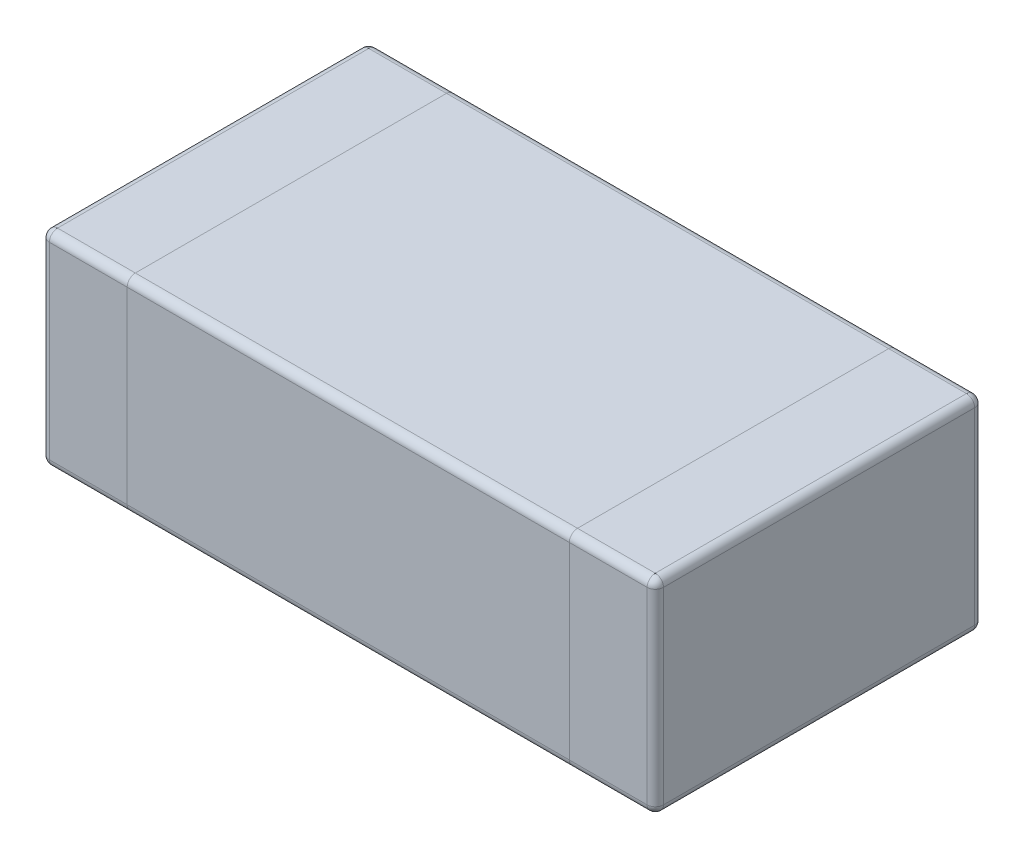
ISO-10303-21;
HEADER;
FILE_DESCRIPTION(('STEP AP214'),'2;1');
FILE_NAME('part.step','',(''),(''),'','','');
FILE_SCHEMA(('AUTOMOTIVE_DESIGN { 1 0 10303 214 1 1 1 1 }'));
ENDSEC;
DATA;
#1=APPLICATION_CONTEXT('core data for automotive mechanical design processes');
#2=APPLICATION_PROTOCOL_DEFINITION('international standard','automotive_design',2000,#1);
#3=PRODUCT_CONTEXT('',#1,'mechanical');
#4=PRODUCT('Part','Part','',(#3));
#5=PRODUCT_RELATED_PRODUCT_CATEGORY('part','',(#4));
#6=PRODUCT_DEFINITION_FORMATION('','',#4);
#7=PRODUCT_DEFINITION_CONTEXT('part definition',#1,'design');
#8=PRODUCT_DEFINITION('design','',#6,#7);
#9=PRODUCT_DEFINITION_SHAPE('','',#8);
#10=(LENGTH_UNIT() NAMED_UNIT(*) SI_UNIT(.MILLI.,.METRE.));
#11=(NAMED_UNIT(*) PLANE_ANGLE_UNIT() SI_UNIT($,.RADIAN.));
#12=(NAMED_UNIT(*) SI_UNIT($,.STERADIAN.) SOLID_ANGLE_UNIT());
#13=UNCERTAINTY_MEASURE_WITH_UNIT(LENGTH_MEASURE(1.E-05),#10,'distance_accuracy_value','');
#14=(GEOMETRIC_REPRESENTATION_CONTEXT(3) GLOBAL_UNCERTAINTY_ASSIGNED_CONTEXT((#13)) GLOBAL_UNIT_ASSIGNED_CONTEXT((#10,
#11,#12)) REPRESENTATION_CONTEXT('',''));
#15=CARTESIAN_POINT('',(0.,0.,0.));
#16=DIRECTION('',(0.,0.,1.));
#17=DIRECTION('',(1.,0.,0.));
#18=AXIS2_PLACEMENT_3D('',#15,#16,#17);
#19=CARTESIAN_POINT('',(-0.73,-0.25,0.38));
#20=DIRECTION('',(0.,1.,0.));
#21=DIRECTION('',(0.,0.,1.));
#22=AXIS2_PLACEMENT_3D('',#19,#20,#21);
#23=PLANE('',#22);
#24=DIRECTION('',(0.,0.,-1.));
#25=VECTOR('',#24,1.);
#26=CARTESIAN_POINT('',(-0.54,-0.25,0.38));
#27=LINE('',#26,#25);
#28=CARTESIAN_POINT('',(-0.54,-0.25,0.38));
#29=VERTEX_POINT('',#28);
#30=CARTESIAN_POINT('',(-0.54,-0.25,-0.38));
#31=VERTEX_POINT('',#30);
#32=EDGE_CURVE('E208',#29,#31,#27,.T.);
#33=ORIENTED_EDGE('',*,*,#32,.F.);
#34=DIRECTION('',(1.,0.,0.));
#35=VECTOR('',#34,1.);
#36=CARTESIAN_POINT('',(-0.73,-0.25,0.38));
#37=LINE('',#36,#35);
#38=CARTESIAN_POINT('',(-0.73,-0.25,0.38));
#39=VERTEX_POINT('',#38);
#40=EDGE_CURVE('E231',#29,#39,#37,.F.);
#41=ORIENTED_EDGE('',*,*,#40,.T.);
#42=DIRECTION('',(0.,0.,1.));
#43=VECTOR('',#42,1.);
#44=CARTESIAN_POINT('',(-0.73,-0.25,0.38));
#45=LINE('',#44,#43);
#46=CARTESIAN_POINT('',(-0.73,-0.25,-0.38));
#47=VERTEX_POINT('',#46);
#48=EDGE_CURVE('E229',#39,#47,#45,.F.);
#49=ORIENTED_EDGE('',*,*,#48,.T.);
#50=DIRECTION('',(-1.,0.,0.));
#51=VECTOR('',#50,1.);
#52=CARTESIAN_POINT('',(-0.73,-0.25,-0.38));
#53=LINE('',#52,#51);
#54=EDGE_CURVE('E227',#47,#31,#53,.F.);
#55=ORIENTED_EDGE('',*,*,#54,.T.);
#56=EDGE_LOOP('',(#33,#41,#49,#55));
#57=FACE_BOUND('',#56,.T.);
#58=ADVANCED_FACE('F37',(#57),#23,.F.);
#59=DIRECTION('',(0.,0.,-1.));
#60=VECTOR('',#59,1.);
#61=CARTESIAN_POINT('',(0.54,-0.25,0.38));
#62=LINE('',#61,#60);
#63=CARTESIAN_POINT('',(0.54,-0.25,0.38));
#64=VERTEX_POINT('',#63);
#65=CARTESIAN_POINT('',(0.54,-0.25,-0.38));
#66=VERTEX_POINT('',#65);
#67=EDGE_CURVE('E214',#64,#66,#62,.T.);
#68=ORIENTED_EDGE('',*,*,#67,.F.);
#69=DIRECTION('',(1.,0.,0.));
#70=VECTOR('',#69,1.);
#71=CARTESIAN_POINT('',(-0.73,-0.25,0.38));
#72=LINE('',#71,#70);
#73=EDGE_CURVE('E219',#64,#29,#72,.F.);
#74=ORIENTED_EDGE('',*,*,#73,.T.);
#75=ORIENTED_EDGE('',*,*,#32,.T.);
#76=DIRECTION('',(-1.,0.,0.));
#77=VECTOR('',#76,1.);
#78=CARTESIAN_POINT('',(-0.73,-0.25,-0.38));
#79=LINE('',#78,#77);
#80=EDGE_CURVE('E210',#31,#66,#79,.F.);
#81=ORIENTED_EDGE('',*,*,#80,.T.);
#82=EDGE_LOOP('',(#68,#74,#75,#81));
#83=FACE_BOUND('',#82,.T.);
#84=ADVANCED_FACE('F445',(#83),#23,.F.);
#85=CARTESIAN_POINT('',(-0.73,0.25,-0.4));
#86=DIRECTION('',(0.,0.,1.));
#87=DIRECTION('',(1.,0.,0.));
#88=AXIS2_PLACEMENT_3D('',#85,#86,#87);
#89=PLANE('',#88);
#90=DIRECTION('',(0.,-1.,0.));
#91=VECTOR('',#90,1.);
#92=CARTESIAN_POINT('',(0.54,0.25,-0.4));
#93=LINE('',#92,#91);
#94=CARTESIAN_POINT('',(0.54,0.23,-0.4));
#95=VERTEX_POINT('',#94);
#96=CARTESIAN_POINT('',(0.54,-0.23,-0.4));
#97=VERTEX_POINT('',#96);
#98=EDGE_CURVE('E194',#95,#97,#93,.T.);
#99=ORIENTED_EDGE('',*,*,#98,.T.);
#100=DIRECTION('',(-1.,0.,0.));
#101=VECTOR('',#100,1.);
#102=CARTESIAN_POINT('',(-0.73,-0.23,-0.4));
#103=LINE('',#102,#101);
#104=CARTESIAN_POINT('',(-0.54,-0.23,-0.4));
#105=VERTEX_POINT('',#104);
#106=EDGE_CURVE('E251',#97,#105,#103,.T.);
#107=ORIENTED_EDGE('',*,*,#106,.T.);
#108=DIRECTION('',(0.,-1.,0.));
#109=VECTOR('',#108,1.);
#110=CARTESIAN_POINT('',(-0.54,0.25,-0.4));
#111=LINE('',#110,#109);
#112=CARTESIAN_POINT('',(-0.54,0.23,-0.4));
#113=VERTEX_POINT('',#112);
#114=EDGE_CURVE('E401',#113,#105,#111,.T.);
#115=ORIENTED_EDGE('',*,*,#114,.F.);
#116=DIRECTION('',(-1.,0.,0.));
#117=VECTOR('',#116,1.);
#118=CARTESIAN_POINT('',(0.54,0.23,-0.4));
#119=LINE('',#118,#117);
#120=EDGE_CURVE('E249',#113,#95,#119,.F.);
#121=ORIENTED_EDGE('',*,*,#120,.T.);
#122=EDGE_LOOP('',(#99,#107,#115,#121));
#123=FACE_BOUND('',#122,.T.);
#124=ADVANCED_FACE('F506',(#123),#89,.F.);
#125=DIRECTION('',(0.,-1.,0.));
#126=VECTOR('',#125,1.);
#127=CARTESIAN_POINT('',(0.73,0.25,-0.4));
#128=LINE('',#127,#126);
#129=CARTESIAN_POINT('',(0.73,0.23,-0.4));
#130=VERTEX_POINT('',#129);
#131=CARTESIAN_POINT('',(0.73,-0.23,-0.4));
#132=VERTEX_POINT('',#131);
#133=EDGE_CURVE('E366',#130,#132,#128,.T.);
#134=ORIENTED_EDGE('',*,*,#133,.T.);
#135=DIRECTION('',(-1.,0.,0.));
#136=VECTOR('',#135,1.);
#137=CARTESIAN_POINT('',(-0.73,-0.23,-0.4));
#138=LINE('',#137,#136);
#139=EDGE_CURVE('E255',#132,#97,#138,.T.);
#140=ORIENTED_EDGE('',*,*,#139,.T.);
#141=ORIENTED_EDGE('',*,*,#98,.F.);
#142=DIRECTION('',(-1.,0.,0.));
#143=VECTOR('',#142,1.);
#144=CARTESIAN_POINT('',(0.73,0.23,-0.4));
#145=LINE('',#144,#143);
#146=EDGE_CURVE('E253',#95,#130,#145,.F.);
#147=ORIENTED_EDGE('',*,*,#146,.T.);
#148=EDGE_LOOP('',(#134,#140,#141,#147));
#149=FACE_BOUND('',#148,.T.);
#150=ADVANCED_FACE('F365',(#149),#89,.F.);
#151=CARTESIAN_POINT('',(-0.73,0.25,0.4));
#152=DIRECTION('',(0.,0.,-1.));
#153=DIRECTION('',(-1.,0.,0.));
#154=AXIS2_PLACEMENT_3D('',#151,#152,#153);
#155=PLANE('',#154);
#156=DIRECTION('',(0.,-1.,0.));
#157=VECTOR('',#156,1.);
#158=CARTESIAN_POINT('',(-0.54,0.25,0.4));
#159=LINE('',#158,#157);
#160=CARTESIAN_POINT('',(-0.54,0.23,0.4));
#161=VERTEX_POINT('',#160);
#162=CARTESIAN_POINT('',(-0.54,-0.23,0.4));
#163=VERTEX_POINT('',#162);
#164=EDGE_CURVE('E195',#161,#163,#159,.T.);
#165=ORIENTED_EDGE('',*,*,#164,.T.);
#166=DIRECTION('',(1.,0.,0.));
#167=VECTOR('',#166,1.);
#168=CARTESIAN_POINT('',(-0.73,-0.23,0.4));
#169=LINE('',#168,#167);
#170=CARTESIAN_POINT('',(0.54,-0.23,0.4));
#171=VERTEX_POINT('',#170);
#172=EDGE_CURVE('E192',#163,#171,#169,.T.);
#173=ORIENTED_EDGE('',*,*,#172,.T.);
#174=DIRECTION('',(0.,-1.,0.));
#175=VECTOR('',#174,1.);
#176=CARTESIAN_POINT('',(0.54,0.25,0.4));
#177=LINE('',#176,#175);
#178=CARTESIAN_POINT('',(0.54,0.23,0.4));
#179=VERTEX_POINT('',#178);
#180=EDGE_CURVE('E177',#179,#171,#177,.T.);
#181=ORIENTED_EDGE('',*,*,#180,.F.);
#182=DIRECTION('',(1.,0.,0.));
#183=VECTOR('',#182,1.);
#184=CARTESIAN_POINT('',(-0.54,0.23,0.4));
#185=LINE('',#184,#183);
#186=EDGE_CURVE('E189',#179,#161,#185,.F.);
#187=ORIENTED_EDGE('',*,*,#186,.T.);
#188=EDGE_LOOP('',(#165,#173,#181,#187));
#189=FACE_BOUND('',#188,.T.);
#190=ADVANCED_FACE('F187',(#189),#155,.F.);
#191=DIRECTION('',(0.,-1.,0.));
#192=VECTOR('',#191,1.);
#193=CARTESIAN_POINT('',(-0.73,0.25,0.4));
#194=LINE('',#193,#192);
#195=CARTESIAN_POINT('',(-0.73,0.23,0.4));
#196=VERTEX_POINT('',#195);
#197=CARTESIAN_POINT('',(-0.73,-0.23,0.4));
#198=VERTEX_POINT('',#197);
#199=EDGE_CURVE('E387',#196,#198,#194,.T.);
#200=ORIENTED_EDGE('',*,*,#199,.T.);
#201=DIRECTION('',(1.,0.,0.));
#202=VECTOR('',#201,1.);
#203=CARTESIAN_POINT('',(-0.73,-0.23,0.4));
#204=LINE('',#203,#202);
#205=EDGE_CURVE('E225',#198,#163,#204,.T.);
#206=ORIENTED_EDGE('',*,*,#205,.T.);
#207=ORIENTED_EDGE('',*,*,#164,.F.);
#208=DIRECTION('',(1.,0.,0.));
#209=VECTOR('',#208,1.);
#210=CARTESIAN_POINT('',(-0.73,0.23,0.4));
#211=LINE('',#210,#209);
#212=EDGE_CURVE('E222',#161,#196,#211,.F.);
#213=ORIENTED_EDGE('',*,*,#212,.T.);
#214=EDGE_LOOP('',(#200,#206,#207,#213));
#215=FACE_BOUND('',#214,.T.);
#216=ADVANCED_FACE('F481',(#215),#155,.F.);
#217=CARTESIAN_POINT('',(-0.73,0.25,0.38));
#218=DIRECTION('',(0.,1.,0.));
#219=DIRECTION('',(0.,0.,1.));
#220=AXIS2_PLACEMENT_3D('',#217,#218,#219);
#221=PLANE('',#220);
#222=DIRECTION('',(0.,0.,-1.));
#223=VECTOR('',#222,1.);
#224=CARTESIAN_POINT('',(0.73,0.25,-0.38));
#225=LINE('',#224,#223);
#226=CARTESIAN_POINT('',(0.73,0.25,0.38));
#227=VERTEX_POINT('',#226);
#228=CARTESIAN_POINT('',(0.73,0.25,-0.38));
#229=VERTEX_POINT('',#228);
#230=EDGE_CURVE('E54',#227,#229,#225,.T.);
#231=ORIENTED_EDGE('',*,*,#230,.T.);
#232=DIRECTION('',(-1.,0.,0.));
#233=VECTOR('',#232,1.);
#234=CARTESIAN_POINT('',(0.54,0.25,-0.38));
#235=LINE('',#234,#233);
#236=CARTESIAN_POINT('',(0.54,0.25,-0.38));
#237=VERTEX_POINT('',#236);
#238=EDGE_CURVE('E288',#229,#237,#235,.T.);
#239=ORIENTED_EDGE('',*,*,#238,.T.);
#240=DIRECTION('',(0.,0.,1.));
#241=VECTOR('',#240,1.);
#242=CARTESIAN_POINT('',(0.54,0.25,0.38));
#243=LINE('',#242,#241);
#244=CARTESIAN_POINT('',(0.54,0.25,0.38));
#245=VERTEX_POINT('',#244);
#246=EDGE_CURVE('E394',#237,#245,#243,.T.);
#247=ORIENTED_EDGE('',*,*,#246,.T.);
#248=DIRECTION('',(1.,0.,0.));
#249=VECTOR('',#248,1.);
#250=CARTESIAN_POINT('',(0.73,0.25,0.38));
#251=LINE('',#250,#249);
#252=EDGE_CURVE('E59',#245,#227,#251,.T.);
#253=ORIENTED_EDGE('',*,*,#252,.T.);
#254=EDGE_LOOP('',(#231,#239,#247,#253));
#255=FACE_BOUND('',#254,.T.);
#256=ADVANCED_FACE('F492',(#255),#221,.T.);
#257=ORIENTED_EDGE('',*,*,#246,.F.);
#258=DIRECTION('',(-1.,0.,0.));
#259=VECTOR('',#258,1.);
#260=CARTESIAN_POINT('',(-0.54,0.25,-0.38));
#261=LINE('',#260,#259);
#262=CARTESIAN_POINT('',(-0.54,0.25,-0.38));
#263=VERTEX_POINT('',#262);
#264=EDGE_CURVE('E284',#237,#263,#261,.T.);
#265=ORIENTED_EDGE('',*,*,#264,.T.);
#266=DIRECTION('',(0.,0.,1.));
#267=VECTOR('',#266,1.);
#268=CARTESIAN_POINT('',(-0.54,0.25,0.38));
#269=LINE('',#268,#267);
#270=CARTESIAN_POINT('',(-0.54,0.25,0.38));
#271=VERTEX_POINT('',#270);
#272=EDGE_CURVE('E390',#263,#271,#269,.T.);
#273=ORIENTED_EDGE('',*,*,#272,.T.);
#274=DIRECTION('',(1.,0.,0.));
#275=VECTOR('',#274,1.);
#276=CARTESIAN_POINT('',(0.54,0.25,0.38));
#277=LINE('',#276,#275);
#278=EDGE_CURVE('E282',#271,#245,#277,.T.);
#279=ORIENTED_EDGE('',*,*,#278,.T.);
#280=EDGE_LOOP('',(#257,#265,#273,#279));
#281=FACE_BOUND('',#280,.T.);
#282=ADVANCED_FACE('F491',(#281),#221,.T.);
#283=CARTESIAN_POINT('',(-0.73,0.25,0.38));
#284=DIRECTION('',(0.,-1.,0.));
#285=DIRECTION('',(0.,0.,-1.));
#286=AXIS2_PLACEMENT_3D('',#283,#284,#285);
#287=CYLINDRICAL_SURFACE('',#286,0.02);
#288=DIRECTION('',(0.,-1.,0.));
#289=VECTOR('',#288,1.);
#290=CARTESIAN_POINT('',(-0.75,0.25,0.38));
#291=LINE('',#290,#289);
#292=CARTESIAN_POINT('',(-0.75,0.23,0.38));
#293=VERTEX_POINT('',#292);
#294=CARTESIAN_POINT('',(-0.75,-0.23,0.38));
#295=VERTEX_POINT('',#294);
#296=EDGE_CURVE('E325',#293,#295,#291,.T.);
#297=ORIENTED_EDGE('',*,*,#296,.T.);
#298=CARTESIAN_POINT('',(-0.73,-0.23,0.38));
#299=DIRECTION('',(0.,-1.,0.));
#300=DIRECTION('',(0.,0.,-1.));
#301=AXIS2_PLACEMENT_3D('',#298,#299,#300);
#302=CIRCLE('',#301,0.02);
#303=EDGE_CURVE('E235',#295,#198,#302,.F.);
#304=ORIENTED_EDGE('',*,*,#303,.T.);
#305=ORIENTED_EDGE('',*,*,#199,.F.);
#306=CARTESIAN_POINT('',(-0.73,0.23,0.38));
#307=DIRECTION('',(0.,-1.,0.));
#308=DIRECTION('',(0.,0.,-1.));
#309=AXIS2_PLACEMENT_3D('',#306,#307,#308);
#310=CIRCLE('',#309,0.02);
#311=EDGE_CURVE('E233',#196,#293,#310,.T.);
#312=ORIENTED_EDGE('',*,*,#311,.T.);
#313=EDGE_LOOP('',(#297,#304,#305,#312));
#314=FACE_BOUND('',#313,.T.);
#315=ADVANCED_FACE('F470',(#314),#287,.T.);
#316=DIRECTION('',(0.,-1.,0.));
#317=VECTOR('',#316,1.);
#318=CARTESIAN_POINT('',(0.73,0.25,0.4));
#319=LINE('',#318,#317);
#320=CARTESIAN_POINT('',(0.73,0.23,0.4));
#321=VERTEX_POINT('',#320);
#322=CARTESIAN_POINT('',(0.73,-0.23,0.4));
#323=VERTEX_POINT('',#322);
#324=EDGE_CURVE('E179',#321,#323,#319,.T.);
#325=ORIENTED_EDGE('',*,*,#324,.F.);
#326=DIRECTION('',(1.,0.,0.));
#327=VECTOR('',#326,1.);
#328=CARTESIAN_POINT('',(0.54,0.23,0.4));
#329=LINE('',#328,#327);
#330=EDGE_CURVE('E11',#321,#179,#329,.F.);
#331=ORIENTED_EDGE('',*,*,#330,.T.);
#332=ORIENTED_EDGE('',*,*,#180,.T.);
#333=DIRECTION('',(1.,0.,0.));
#334=VECTOR('',#333,1.);
#335=CARTESIAN_POINT('',(-0.73,-0.23,0.4));
#336=LINE('',#335,#334);
#337=EDGE_CURVE('E46',#171,#323,#336,.T.);
#338=ORIENTED_EDGE('',*,*,#337,.T.);
#339=EDGE_LOOP('',(#325,#331,#332,#338));
#340=FACE_BOUND('',#339,.T.);
#341=ADVANCED_FACE('F176',(#340),#155,.F.);
#342=CARTESIAN_POINT('',(0.73,0.25,0.38));
#343=DIRECTION('',(0.,-1.,0.));
#344=DIRECTION('',(0.,0.,-1.));
#345=AXIS2_PLACEMENT_3D('',#342,#343,#344);
#346=CYLINDRICAL_SURFACE('',#345,0.0200000000000001);
#347=ORIENTED_EDGE('',*,*,#324,.T.);
#348=CARTESIAN_POINT('',(0.73,-0.23,0.38));
#349=DIRECTION('',(0.,-1.,0.));
#350=DIRECTION('',(0.,0.,-1.));
#351=AXIS2_PLACEMENT_3D('',#348,#349,#350);
#352=CIRCLE('',#351,0.0200000000000001);
#353=CARTESIAN_POINT('',(0.75,-0.23,0.38));
#354=VERTEX_POINT('',#353);
#355=EDGE_CURVE('E273',#323,#354,#352,.F.);
#356=ORIENTED_EDGE('',*,*,#355,.T.);
#357=DIRECTION('',(0.,-1.,0.));
#358=VECTOR('',#357,1.);
#359=CARTESIAN_POINT('',(0.75,0.25,0.38));
#360=LINE('',#359,#358);
#361=CARTESIAN_POINT('',(0.75,0.23,0.38));
#362=VERTEX_POINT('',#361);
#363=EDGE_CURVE('E377',#362,#354,#360,.T.);
#364=ORIENTED_EDGE('',*,*,#363,.F.);
#365=CARTESIAN_POINT('',(0.73,0.23,0.38));
#366=DIRECTION('',(0.,-1.,0.));
#367=DIRECTION('',(0.,0.,-1.));
#368=AXIS2_PLACEMENT_3D('',#365,#366,#367);
#369=CIRCLE('',#368,0.0200000000000001);
#370=EDGE_CURVE('E271',#362,#321,#369,.T.);
#371=ORIENTED_EDGE('',*,*,#370,.T.);
#372=EDGE_LOOP('',(#347,#356,#364,#371));
#373=FACE_BOUND('',#372,.T.);
#374=ADVANCED_FACE('F782',(#373),#346,.T.);
#375=CARTESIAN_POINT('',(0.75,0.25,0.38));
#376=DIRECTION('',(-1.,0.,0.));
#377=DIRECTION('',(0.,0.,1.));
#378=AXIS2_PLACEMENT_3D('',#375,#376,#377);
#379=PLANE('',#378);
#380=ORIENTED_EDGE('',*,*,#363,.T.);
#381=DIRECTION('',(0.,0.,-1.));
#382=VECTOR('',#381,1.);
#383=CARTESIAN_POINT('',(0.75,-0.23,0.38));
#384=LINE('',#383,#382);
#385=CARTESIAN_POINT('',(0.75,-0.23,-0.38));
#386=VERTEX_POINT('',#385);
#387=EDGE_CURVE('E269',#354,#386,#384,.T.);
#388=ORIENTED_EDGE('',*,*,#387,.T.);
#389=DIRECTION('',(0.,-1.,0.));
#390=VECTOR('',#389,1.);
#391=CARTESIAN_POINT('',(0.75,0.25,-0.38));
#392=LINE('',#391,#390);
#393=CARTESIAN_POINT('',(0.75,0.23,-0.38));
#394=VERTEX_POINT('',#393);
#395=EDGE_CURVE('E374',#394,#386,#392,.T.);
#396=ORIENTED_EDGE('',*,*,#395,.F.);
#397=DIRECTION('',(0.,0.,-1.));
#398=VECTOR('',#397,1.);
#399=CARTESIAN_POINT('',(0.75,0.23,0.38));
#400=LINE('',#399,#398);
#401=EDGE_CURVE('E267',#394,#362,#400,.F.);
#402=ORIENTED_EDGE('',*,*,#401,.T.);
#403=EDGE_LOOP('',(#380,#388,#396,#402));
#404=FACE_BOUND('',#403,.T.);
#405=ADVANCED_FACE('F790',(#404),#379,.F.);
#406=CARTESIAN_POINT('',(0.73,0.25,-0.38));
#407=DIRECTION('',(0.,-1.,0.));
#408=DIRECTION('',(0.,0.,-1.));
#409=AXIS2_PLACEMENT_3D('',#406,#407,#408);
#410=CYLINDRICAL_SURFACE('',#409,0.0200000000000001);
#411=ORIENTED_EDGE('',*,*,#395,.T.);
#412=CARTESIAN_POINT('',(0.73,-0.23,-0.38));
#413=DIRECTION('',(0.,-1.,0.));
#414=DIRECTION('',(0.,0.,-1.));
#415=AXIS2_PLACEMENT_3D('',#412,#413,#414);
#416=CIRCLE('',#415,0.0200000000000001);
#417=EDGE_CURVE('E265',#386,#132,#416,.F.);
#418=ORIENTED_EDGE('',*,*,#417,.T.);
#419=ORIENTED_EDGE('',*,*,#133,.F.);
#420=CARTESIAN_POINT('',(0.73,0.23,-0.38));
#421=DIRECTION('',(0.,-1.,0.));
#422=DIRECTION('',(0.,0.,-1.));
#423=AXIS2_PLACEMENT_3D('',#420,#421,#422);
#424=CIRCLE('',#423,0.0200000000000001);
#425=EDGE_CURVE('E263',#130,#394,#424,.T.);
#426=ORIENTED_EDGE('',*,*,#425,.T.);
#427=EDGE_LOOP('',(#411,#418,#419,#426));
#428=FACE_BOUND('',#427,.T.);
#429=ADVANCED_FACE('F371',(#428),#410,.T.);
#430=ORIENTED_EDGE('',*,*,#114,.T.);
#431=DIRECTION('',(-1.,0.,0.));
#432=VECTOR('',#431,1.);
#433=CARTESIAN_POINT('',(-0.73,-0.23,-0.4));
#434=LINE('',#433,#432);
#435=CARTESIAN_POINT('',(-0.73,-0.23,-0.4));
#436=VERTEX_POINT('',#435);
#437=EDGE_CURVE('E247',#105,#436,#434,.T.);
#438=ORIENTED_EDGE('',*,*,#437,.T.);
#439=DIRECTION('',(0.,-1.,0.));
#440=VECTOR('',#439,1.);
#441=CARTESIAN_POINT('',(-0.73,0.25,-0.4));
#442=LINE('',#441,#440);
#443=CARTESIAN_POINT('',(-0.73,0.23,-0.4));
#444=VERTEX_POINT('',#443);
#445=EDGE_CURVE('E375',#444,#436,#442,.T.);
#446=ORIENTED_EDGE('',*,*,#445,.F.);
#447=DIRECTION('',(-1.,0.,0.));
#448=VECTOR('',#447,1.);
#449=CARTESIAN_POINT('',(-0.54,0.23,-0.4));
#450=LINE('',#449,#448);
#451=EDGE_CURVE('E245',#444,#113,#450,.F.);
#452=ORIENTED_EDGE('',*,*,#451,.T.);
#453=EDGE_LOOP('',(#430,#438,#446,#452));
#454=FACE_BOUND('',#453,.T.);
#455=ADVANCED_FACE('F733',(#454),#89,.F.);
#456=CARTESIAN_POINT('',(-0.73,0.25,-0.38));
#457=DIRECTION('',(0.,-1.,0.));
#458=DIRECTION('',(0.,0.,-1.));
#459=AXIS2_PLACEMENT_3D('',#456,#457,#458);
#460=CYLINDRICAL_SURFACE('',#459,0.02);
#461=ORIENTED_EDGE('',*,*,#445,.T.);
#462=CARTESIAN_POINT('',(-0.73,-0.23,-0.38));
#463=DIRECTION('',(0.,-1.,0.));
#464=DIRECTION('',(0.,0.,-1.));
#465=AXIS2_PLACEMENT_3D('',#462,#463,#464);
#466=CIRCLE('',#465,0.02);
#467=CARTESIAN_POINT('',(-0.75,-0.23,-0.38));
#468=VERTEX_POINT('',#467);
#469=EDGE_CURVE('E243',#436,#468,#466,.F.);
#470=ORIENTED_EDGE('',*,*,#469,.T.);
#471=DIRECTION('',(0.,-1.,0.));
#472=VECTOR('',#471,1.);
#473=CARTESIAN_POINT('',(-0.75,0.25,-0.38));
#474=LINE('',#473,#472);
#475=CARTESIAN_POINT('',(-0.75,0.23,-0.38));
#476=VERTEX_POINT('',#475);
#477=EDGE_CURVE('E380',#476,#468,#474,.T.);
#478=ORIENTED_EDGE('',*,*,#477,.F.);
#479=CARTESIAN_POINT('',(-0.73,0.23,-0.38));
#480=DIRECTION('',(0.,-1.,0.));
#481=DIRECTION('',(0.,0.,-1.));
#482=AXIS2_PLACEMENT_3D('',#479,#480,#481);
#483=CIRCLE('',#482,0.02);
#484=EDGE_CURVE('E241',#476,#444,#483,.T.);
#485=ORIENTED_EDGE('',*,*,#484,.T.);
#486=EDGE_LOOP('',(#461,#470,#478,#485));
#487=FACE_BOUND('',#486,.T.);
#488=ADVANCED_FACE('F817',(#487),#460,.T.);
#489=CARTESIAN_POINT('',(-0.75,0.25,0.38));
#490=DIRECTION('',(1.,0.,0.));
#491=DIRECTION('',(0.,0.,-1.));
#492=AXIS2_PLACEMENT_3D('',#489,#490,#491);
#493=PLANE('',#492);
#494=ORIENTED_EDGE('',*,*,#477,.T.);
#495=DIRECTION('',(0.,0.,1.));
#496=VECTOR('',#495,1.);
#497=CARTESIAN_POINT('',(-0.75,-0.23,0.38));
#498=LINE('',#497,#496);
#499=EDGE_CURVE('E239',#468,#295,#498,.T.);
#500=ORIENTED_EDGE('',*,*,#499,.T.);
#501=ORIENTED_EDGE('',*,*,#296,.F.);
#502=DIRECTION('',(0.,0.,1.));
#503=VECTOR('',#502,1.);
#504=CARTESIAN_POINT('',(-0.75,0.23,-0.38));
#505=LINE('',#504,#503);
#506=EDGE_CURVE('E237',#293,#476,#505,.F.);
#507=ORIENTED_EDGE('',*,*,#506,.T.);
#508=EDGE_LOOP('',(#494,#500,#501,#507));
#509=FACE_BOUND('',#508,.T.);
#510=ADVANCED_FACE('F466',(#509),#493,.F.);
#511=DIRECTION('',(0.,0.,1.));
#512=VECTOR('',#511,1.);
#513=CARTESIAN_POINT('',(-0.73,0.25,0.38));
#514=LINE('',#513,#512);
#515=CARTESIAN_POINT('',(-0.73,0.25,-0.38));
#516=VERTEX_POINT('',#515);
#517=CARTESIAN_POINT('',(-0.73,0.25,0.38));
#518=VERTEX_POINT('',#517);
#519=EDGE_CURVE('E277',#516,#518,#514,.T.);
#520=ORIENTED_EDGE('',*,*,#519,.T.);
#521=DIRECTION('',(1.,0.,0.));
#522=VECTOR('',#521,1.);
#523=CARTESIAN_POINT('',(-0.54,0.25,0.38));
#524=LINE('',#523,#522);
#525=EDGE_CURVE('E279',#518,#271,#524,.T.);
#526=ORIENTED_EDGE('',*,*,#525,.T.);
#527=ORIENTED_EDGE('',*,*,#272,.F.);
#528=DIRECTION('',(-1.,0.,0.));
#529=VECTOR('',#528,1.);
#530=CARTESIAN_POINT('',(-0.73,0.25,-0.38));
#531=LINE('',#530,#529);
#532=EDGE_CURVE('E275',#263,#516,#531,.T.);
#533=ORIENTED_EDGE('',*,*,#532,.T.);
#534=EDGE_LOOP('',(#520,#526,#527,#533));
#535=FACE_BOUND('',#534,.T.);
#536=ADVANCED_FACE('F487',(#535),#221,.T.);
#537=ORIENTED_EDGE('',*,*,#67,.T.);
#538=DIRECTION('',(-1.,0.,0.));
#539=VECTOR('',#538,1.);
#540=CARTESIAN_POINT('',(-0.73,-0.25,-0.38));
#541=LINE('',#540,#539);
#542=CARTESIAN_POINT('',(0.73,-0.25,-0.38));
#543=VERTEX_POINT('',#542);
#544=EDGE_CURVE('E261',#66,#543,#541,.F.);
#545=ORIENTED_EDGE('',*,*,#544,.T.);
#546=DIRECTION('',(0.,0.,-1.));
#547=VECTOR('',#546,1.);
#548=CARTESIAN_POINT('',(0.73,-0.25,0.38));
#549=LINE('',#548,#547);
#550=CARTESIAN_POINT('',(0.73,-0.25,0.38));
#551=VERTEX_POINT('',#550);
#552=EDGE_CURVE('E259',#543,#551,#549,.F.);
#553=ORIENTED_EDGE('',*,*,#552,.T.);
#554=DIRECTION('',(1.,0.,0.));
#555=VECTOR('',#554,1.);
#556=CARTESIAN_POINT('',(-0.73,-0.25,0.38));
#557=LINE('',#556,#555);
#558=EDGE_CURVE('E257',#551,#64,#557,.F.);
#559=ORIENTED_EDGE('',*,*,#558,.T.);
#560=EDGE_LOOP('',(#537,#545,#553,#559));
#561=FACE_BOUND('',#560,.T.);
#562=ADVANCED_FACE('F411',(#561),#23,.F.);
#563=CARTESIAN_POINT('',(-0.73,-0.23,-0.38));
#564=DIRECTION('',(-1.,0.,0.));
#565=DIRECTION('',(0.,0.,1.));
#566=AXIS2_PLACEMENT_3D('',#563,#564,#565);
#567=CYLINDRICAL_SURFACE('',#566,0.02);
#568=CARTESIAN_POINT('',(0.54,-0.23,-0.38));
#569=DIRECTION('',(1.,0.,0.));
#570=DIRECTION('',(0.,0.,-1.));
#571=AXIS2_PLACEMENT_3D('',#568,#569,#570);
#572=CIRCLE('',#571,0.02);
#573=EDGE_CURVE('E319',#66,#97,#572,.T.);
#574=ORIENTED_EDGE('',*,*,#573,.F.);
#575=ORIENTED_EDGE('',*,*,#80,.F.);
#576=CARTESIAN_POINT('',(-0.54,-0.23,-0.38));
#577=DIRECTION('',(-1.,0.,0.));
#578=DIRECTION('',(0.,-1.,0.));
#579=AXIS2_PLACEMENT_3D('',#576,#577,#578);
#580=CIRCLE('',#579,0.02);
#581=EDGE_CURVE('E322',#105,#31,#580,.T.);
#582=ORIENTED_EDGE('',*,*,#581,.F.);
#583=ORIENTED_EDGE('',*,*,#106,.F.);
#584=EDGE_LOOP('',(#574,#575,#582,#583));
#585=FACE_BOUND('',#584,.T.);
#586=ADVANCED_FACE('F420',(#585),#567,.T.);
#587=CARTESIAN_POINT('',(-0.73,-0.23,-0.38));
#588=DIRECTION('',(-1.,0.,0.));
#589=DIRECTION('',(0.,0.,1.));
#590=AXIS2_PLACEMENT_3D('',#587,#588,#589);
#591=CYLINDRICAL_SURFACE('',#590,0.02);
#592=ORIENTED_EDGE('',*,*,#581,.T.);
#593=ORIENTED_EDGE('',*,*,#54,.F.);
#594=CARTESIAN_POINT('',(-0.73,-0.23,-0.38));
#595=DIRECTION('',(-1.,0.,0.));
#596=DIRECTION('',(0.,0.,1.));
#597=AXIS2_PLACEMENT_3D('',#594,#595,#596);
#598=CIRCLE('',#597,0.02);
#599=EDGE_CURVE('E316',#436,#47,#598,.T.);
#600=ORIENTED_EDGE('',*,*,#599,.F.);
#601=ORIENTED_EDGE('',*,*,#437,.F.);
#602=EDGE_LOOP('',(#592,#593,#600,#601));
#603=FACE_BOUND('',#602,.T.);
#604=ADVANCED_FACE('F451',(#603),#591,.T.);
#605=CARTESIAN_POINT('',(-0.73,-0.23,-0.38));
#606=DIRECTION('',(-1.,0.,0.));
#607=DIRECTION('',(0.,0.,1.));
#608=AXIS2_PLACEMENT_3D('',#605,#606,#607);
#609=CYLINDRICAL_SURFACE('',#608,0.02);
#610=ORIENTED_EDGE('',*,*,#573,.T.);
#611=ORIENTED_EDGE('',*,*,#139,.F.);
#612=CARTESIAN_POINT('',(0.73,-0.23,-0.38));
#613=DIRECTION('',(1.,0.,0.));
#614=DIRECTION('',(0.,0.,-1.));
#615=AXIS2_PLACEMENT_3D('',#612,#613,#614);
#616=CIRCLE('',#615,0.02);
#617=EDGE_CURVE('E313',#543,#132,#616,.T.);
#618=ORIENTED_EDGE('',*,*,#617,.F.);
#619=ORIENTED_EDGE('',*,*,#544,.F.);
#620=EDGE_LOOP('',(#610,#611,#618,#619));
#621=FACE_BOUND('',#620,.T.);
#622=ADVANCED_FACE('F423',(#621),#609,.T.);
#623=CARTESIAN_POINT('',(-0.73,-0.23,-0.38));
#624=DIRECTION('',(0.,1.,0.));
#625=DIRECTION('',(0.,0.,1.));
#626=AXIS2_PLACEMENT_3D('',#623,#624,#625);
#627=SPHERICAL_SURFACE('',#626,0.02);
#628=ORIENTED_EDGE('',*,*,#469,.F.);
#629=ORIENTED_EDGE('',*,*,#599,.T.);
#630=CARTESIAN_POINT('',(-0.73,-0.23,-0.38));
#631=DIRECTION('',(0.,0.,1.));
#632=DIRECTION('',(1.,0.,0.));
#633=AXIS2_PLACEMENT_3D('',#630,#631,#632);
#634=CIRCLE('',#633,0.02);
#635=EDGE_CURVE('E310',#468,#47,#634,.T.);
#636=ORIENTED_EDGE('',*,*,#635,.F.);
#637=EDGE_LOOP('',(#628,#629,#636));
#638=FACE_BOUND('',#637,.T.);
#639=ADVANCED_FACE('F456',(#638),#627,.T.);
#640=CARTESIAN_POINT('',(0.73,-0.23,-0.38));
#641=DIRECTION('',(0.,1.,0.));
#642=DIRECTION('',(0.,0.,1.));
#643=AXIS2_PLACEMENT_3D('',#640,#641,#642);
#644=SPHERICAL_SURFACE('',#643,0.02);
#645=ORIENTED_EDGE('',*,*,#617,.T.);
#646=ORIENTED_EDGE('',*,*,#417,.F.);
#647=CARTESIAN_POINT('',(0.73,-0.23,-0.38));
#648=DIRECTION('',(0.,0.,1.));
#649=DIRECTION('',(1.,0.,0.));
#650=AXIS2_PLACEMENT_3D('',#647,#648,#649);
#651=CIRCLE('',#650,0.02);
#652=EDGE_CURVE('E307',#543,#386,#651,.T.);
#653=ORIENTED_EDGE('',*,*,#652,.F.);
#654=EDGE_LOOP('',(#645,#646,#653));
#655=FACE_BOUND('',#654,.T.);
#656=ADVANCED_FACE('F427',(#655),#644,.T.);
#657=CARTESIAN_POINT('',(-0.73,-0.23,0.38));
#658=DIRECTION('',(0.,0.,1.));
#659=DIRECTION('',(1.,0.,0.));
#660=AXIS2_PLACEMENT_3D('',#657,#658,#659);
#661=CYLINDRICAL_SURFACE('',#660,0.02);
#662=ORIENTED_EDGE('',*,*,#635,.T.);
#663=ORIENTED_EDGE('',*,*,#48,.F.);
#664=CARTESIAN_POINT('',(-0.73,-0.23,0.38));
#665=DIRECTION('',(0.,0.,1.));
#666=DIRECTION('',(1.,0.,0.));
#667=AXIS2_PLACEMENT_3D('',#664,#665,#666);
#668=CIRCLE('',#667,0.02);
#669=EDGE_CURVE('E304',#295,#39,#668,.T.);
#670=ORIENTED_EDGE('',*,*,#669,.F.);
#671=ORIENTED_EDGE('',*,*,#499,.F.);
#672=EDGE_LOOP('',(#662,#663,#670,#671));
#673=FACE_BOUND('',#672,.T.);
#674=ADVANCED_FACE('F459',(#673),#661,.T.);
#675=CARTESIAN_POINT('',(0.73,-0.23,0.38));
#676=DIRECTION('',(0.,0.,-1.));
#677=DIRECTION('',(-1.,0.,0.));
#678=AXIS2_PLACEMENT_3D('',#675,#676,#677);
#679=CYLINDRICAL_SURFACE('',#678,0.02);
#680=ORIENTED_EDGE('',*,*,#652,.T.);
#681=ORIENTED_EDGE('',*,*,#387,.F.);
#682=CARTESIAN_POINT('',(0.73,-0.23,0.38));
#683=DIRECTION('',(0.,0.,1.));
#684=DIRECTION('',(1.,0.,0.));
#685=AXIS2_PLACEMENT_3D('',#682,#683,#684);
#686=CIRCLE('',#685,0.02);
#687=EDGE_CURVE('E301',#551,#354,#686,.T.);
#688=ORIENTED_EDGE('',*,*,#687,.F.);
#689=ORIENTED_EDGE('',*,*,#552,.F.);
#690=EDGE_LOOP('',(#680,#681,#688,#689));
#691=FACE_BOUND('',#690,.T.);
#692=ADVANCED_FACE('F431',(#691),#679,.T.);
#693=CARTESIAN_POINT('',(-0.73,-0.23,0.38));
#694=DIRECTION('',(0.,1.,0.));
#695=DIRECTION('',(0.,0.,1.));
#696=AXIS2_PLACEMENT_3D('',#693,#694,#695);
#697=SPHERICAL_SURFACE('',#696,0.02);
#698=ORIENTED_EDGE('',*,*,#303,.F.);
#699=ORIENTED_EDGE('',*,*,#669,.T.);
#700=CARTESIAN_POINT('',(-0.73,-0.23,0.38));
#701=DIRECTION('',(1.,0.,0.));
#702=DIRECTION('',(0.,0.,-1.));
#703=AXIS2_PLACEMENT_3D('',#700,#701,#702);
#704=CIRCLE('',#703,0.02);
#705=EDGE_CURVE('E298',#198,#39,#704,.T.);
#706=ORIENTED_EDGE('',*,*,#705,.F.);
#707=EDGE_LOOP('',(#698,#699,#706));
#708=FACE_BOUND('',#707,.T.);
#709=ADVANCED_FACE('F569',(#708),#697,.T.);
#710=CARTESIAN_POINT('',(0.73,-0.23,0.38));
#711=DIRECTION('',(0.,1.,0.));
#712=DIRECTION('',(0.,0.,1.));
#713=AXIS2_PLACEMENT_3D('',#710,#711,#712);
#714=SPHERICAL_SURFACE('',#713,0.02);
#715=ORIENTED_EDGE('',*,*,#687,.T.);
#716=ORIENTED_EDGE('',*,*,#355,.F.);
#717=CARTESIAN_POINT('',(0.73,-0.23,0.38));
#718=DIRECTION('',(-1.,0.,0.));
#719=DIRECTION('',(0.,0.,1.));
#720=AXIS2_PLACEMENT_3D('',#717,#718,#719);
#721=CIRCLE('',#720,0.02);
#722=EDGE_CURVE('E295',#551,#323,#721,.T.);
#723=ORIENTED_EDGE('',*,*,#722,.F.);
#724=EDGE_LOOP('',(#715,#716,#723));
#725=FACE_BOUND('',#724,.T.);
#726=ADVANCED_FACE('F435',(#725),#714,.T.);
#727=CARTESIAN_POINT('',(-0.73,-0.23,0.38));
#728=DIRECTION('',(1.,0.,0.));
#729=DIRECTION('',(0.,0.,-1.));
#730=AXIS2_PLACEMENT_3D('',#727,#728,#729);
#731=CYLINDRICAL_SURFACE('',#730,0.02);
#732=ORIENTED_EDGE('',*,*,#705,.T.);
#733=ORIENTED_EDGE('',*,*,#40,.F.);
#734=CARTESIAN_POINT('',(-0.54,-0.23,0.38));
#735=DIRECTION('',(1.,0.,0.));
#736=DIRECTION('',(0.,1.,0.));
#737=AXIS2_PLACEMENT_3D('',#734,#735,#736);
#738=CIRCLE('',#737,0.02);
#739=EDGE_CURVE('E293',#163,#29,#738,.T.);
#740=ORIENTED_EDGE('',*,*,#739,.F.);
#741=ORIENTED_EDGE('',*,*,#205,.F.);
#742=EDGE_LOOP('',(#732,#733,#740,#741));
#743=FACE_BOUND('',#742,.T.);
#744=ADVANCED_FACE('F560',(#743),#731,.T.);
#745=CARTESIAN_POINT('',(-0.73,-0.23,0.38));
#746=DIRECTION('',(1.,0.,0.));
#747=DIRECTION('',(0.,0.,-1.));
#748=AXIS2_PLACEMENT_3D('',#745,#746,#747);
#749=CYLINDRICAL_SURFACE('',#748,0.02);
#750=ORIENTED_EDGE('',*,*,#722,.T.);
#751=ORIENTED_EDGE('',*,*,#337,.F.);
#752=CARTESIAN_POINT('',(0.54,-0.23,0.38));
#753=DIRECTION('',(-1.,0.,0.));
#754=DIRECTION('',(0.,0.,1.));
#755=AXIS2_PLACEMENT_3D('',#752,#753,#754);
#756=CIRCLE('',#755,0.02);
#757=EDGE_CURVE('E291',#64,#171,#756,.T.);
#758=ORIENTED_EDGE('',*,*,#757,.F.);
#759=ORIENTED_EDGE('',*,*,#558,.F.);
#760=EDGE_LOOP('',(#750,#751,#758,#759));
#761=FACE_BOUND('',#760,.T.);
#762=ADVANCED_FACE('F439',(#761),#749,.T.);
#763=CARTESIAN_POINT('',(-0.73,-0.23,0.38));
#764=DIRECTION('',(1.,0.,0.));
#765=DIRECTION('',(0.,0.,-1.));
#766=AXIS2_PLACEMENT_3D('',#763,#764,#765);
#767=CYLINDRICAL_SURFACE('',#766,0.02);
#768=ORIENTED_EDGE('',*,*,#739,.T.);
#769=ORIENTED_EDGE('',*,*,#73,.F.);
#770=ORIENTED_EDGE('',*,*,#757,.T.);
#771=ORIENTED_EDGE('',*,*,#172,.F.);
#772=EDGE_LOOP('',(#768,#769,#770,#771));
#773=FACE_BOUND('',#772,.T.);
#774=ADVANCED_FACE('F441',(#773),#767,.T.);
#775=CARTESIAN_POINT('',(-0.73,0.23,-0.38));
#776=DIRECTION('',(1.,0.,0.));
#777=DIRECTION('',(0.,0.,-1.));
#778=AXIS2_PLACEMENT_3D('',#775,#776,#777);
#779=CYLINDRICAL_SURFACE('',#778,0.02);
#780=CARTESIAN_POINT('',(0.73,0.23,-0.38));
#781=DIRECTION('',(1.,0.,0.));
#782=DIRECTION('',(0.,0.,-1.));
#783=AXIS2_PLACEMENT_3D('',#780,#781,#782);
#784=CIRCLE('',#783,0.02);
#785=EDGE_CURVE('E346',#130,#229,#784,.T.);
#786=ORIENTED_EDGE('',*,*,#785,.F.);
#787=ORIENTED_EDGE('',*,*,#146,.F.);
#788=CARTESIAN_POINT('',(0.54,0.23,-0.38));
#789=DIRECTION('',(-1.,0.,0.));
#790=DIRECTION('',(0.,0.,1.));
#791=AXIS2_PLACEMENT_3D('',#788,#789,#790);
#792=CIRCLE('',#791,0.02);
#793=EDGE_CURVE('E41',#237,#95,#792,.T.);
#794=ORIENTED_EDGE('',*,*,#793,.F.);
#795=ORIENTED_EDGE('',*,*,#238,.F.);
#796=EDGE_LOOP('',(#786,#787,#794,#795));
#797=FACE_BOUND('',#796,.T.);
#798=ADVANCED_FACE('F39',(#797),#779,.T.);
#799=CARTESIAN_POINT('',(-0.73,0.23,-0.38));
#800=DIRECTION('',(1.,0.,0.));
#801=DIRECTION('',(0.,0.,-1.));
#802=AXIS2_PLACEMENT_3D('',#799,#800,#801);
#803=CYLINDRICAL_SURFACE('',#802,0.02);
#804=ORIENTED_EDGE('',*,*,#793,.T.);
#805=ORIENTED_EDGE('',*,*,#120,.F.);
#806=CARTESIAN_POINT('',(-0.54,0.23,-0.38));
#807=DIRECTION('',(-1.,0.,0.));
#808=DIRECTION('',(0.,0.,1.));
#809=AXIS2_PLACEMENT_3D('',#806,#807,#808);
#810=CIRCLE('',#809,0.02);
#811=EDGE_CURVE('E344',#263,#113,#810,.T.);
#812=ORIENTED_EDGE('',*,*,#811,.F.);
#813=ORIENTED_EDGE('',*,*,#264,.F.);
#814=EDGE_LOOP('',(#804,#805,#812,#813));
#815=FACE_BOUND('',#814,.T.);
#816=ADVANCED_FACE('F357',(#815),#803,.T.);
#817=CARTESIAN_POINT('',(0.73,0.23,-0.38));
#818=DIRECTION('',(0.,1.,0.));
#819=DIRECTION('',(0.,0.,1.));
#820=AXIS2_PLACEMENT_3D('',#817,#818,#819);
#821=SPHERICAL_SURFACE('',#820,0.02);
#822=ORIENTED_EDGE('',*,*,#425,.F.);
#823=ORIENTED_EDGE('',*,*,#785,.T.);
#824=CARTESIAN_POINT('',(0.73,0.23,-0.38));
#825=DIRECTION('',(0.,0.,1.));
#826=DIRECTION('',(1.,0.,0.));
#827=AXIS2_PLACEMENT_3D('',#824,#825,#826);
#828=CIRCLE('',#827,0.02);
#829=EDGE_CURVE('E341',#394,#229,#828,.T.);
#830=ORIENTED_EDGE('',*,*,#829,.F.);
#831=EDGE_LOOP('',(#822,#823,#830));
#832=FACE_BOUND('',#831,.T.);
#833=ADVANCED_FACE('F546',(#832),#821,.T.);
#834=CARTESIAN_POINT('',(-0.73,0.23,-0.38));
#835=DIRECTION('',(1.,0.,0.));
#836=DIRECTION('',(0.,0.,-1.));
#837=AXIS2_PLACEMENT_3D('',#834,#835,#836);
#838=CYLINDRICAL_SURFACE('',#837,0.02);
#839=ORIENTED_EDGE('',*,*,#811,.T.);
#840=ORIENTED_EDGE('',*,*,#451,.F.);
#841=CARTESIAN_POINT('',(-0.73,0.23,-0.38));
#842=DIRECTION('',(-1.,0.,0.));
#843=DIRECTION('',(0.,0.,1.));
#844=AXIS2_PLACEMENT_3D('',#841,#842,#843);
#845=CIRCLE('',#844,0.02);
#846=EDGE_CURVE('E338',#516,#444,#845,.T.);
#847=ORIENTED_EDGE('',*,*,#846,.F.);
#848=ORIENTED_EDGE('',*,*,#532,.F.);
#849=EDGE_LOOP('',(#839,#840,#847,#848));
#850=FACE_BOUND('',#849,.T.);
#851=ADVANCED_FACE('F542',(#850),#838,.T.);
#852=CARTESIAN_POINT('',(0.73,0.23,0.38));
#853=DIRECTION('',(0.,0.,1.));
#854=DIRECTION('',(1.,0.,0.));
#855=AXIS2_PLACEMENT_3D('',#852,#853,#854);
#856=CYLINDRICAL_SURFACE('',#855,0.02);
#857=ORIENTED_EDGE('',*,*,#829,.T.);
#858=ORIENTED_EDGE('',*,*,#230,.F.);
#859=CARTESIAN_POINT('',(0.73,0.23,0.38));
#860=DIRECTION('',(0.,0.,1.));
#861=DIRECTION('',(1.,0.,0.));
#862=AXIS2_PLACEMENT_3D('',#859,#860,#861);
#863=CIRCLE('',#862,0.02);
#864=EDGE_CURVE('E335',#362,#227,#863,.T.);
#865=ORIENTED_EDGE('',*,*,#864,.F.);
#866=ORIENTED_EDGE('',*,*,#401,.F.);
#867=EDGE_LOOP('',(#857,#858,#865,#866));
#868=FACE_BOUND('',#867,.T.);
#869=ADVANCED_FACE('F538',(#868),#856,.T.);
#870=CARTESIAN_POINT('',(-0.73,0.23,-0.38));
#871=DIRECTION('',(0.,1.,0.));
#872=DIRECTION('',(0.,0.,1.));
#873=AXIS2_PLACEMENT_3D('',#870,#871,#872);
#874=SPHERICAL_SURFACE('',#873,0.02);
#875=ORIENTED_EDGE('',*,*,#846,.T.);
#876=ORIENTED_EDGE('',*,*,#484,.F.);
#877=CARTESIAN_POINT('',(-0.73,0.23,-0.38));
#878=DIRECTION('',(0.,0.,1.));
#879=DIRECTION('',(1.,0.,0.));
#880=AXIS2_PLACEMENT_3D('',#877,#878,#879);
#881=CIRCLE('',#880,0.02);
#882=EDGE_CURVE('E332',#516,#476,#881,.T.);
#883=ORIENTED_EDGE('',*,*,#882,.F.);
#884=EDGE_LOOP('',(#875,#876,#883));
#885=FACE_BOUND('',#884,.T.);
#886=ADVANCED_FACE('F534',(#885),#874,.T.);
#887=CARTESIAN_POINT('',(0.73,0.23,0.38));
#888=DIRECTION('',(0.,1.,0.));
#889=DIRECTION('',(0.,0.,1.));
#890=AXIS2_PLACEMENT_3D('',#887,#888,#889);
#891=SPHERICAL_SURFACE('',#890,0.02);
#892=ORIENTED_EDGE('',*,*,#370,.F.);
#893=ORIENTED_EDGE('',*,*,#864,.T.);
#894=CARTESIAN_POINT('',(0.73,0.23,0.38));
#895=DIRECTION('',(-1.,0.,0.));
#896=DIRECTION('',(0.,0.,1.));
#897=AXIS2_PLACEMENT_3D('',#894,#895,#896);
#898=CIRCLE('',#897,0.02);
#899=EDGE_CURVE('E330',#321,#227,#898,.T.);
#900=ORIENTED_EDGE('',*,*,#899,.F.);
#901=EDGE_LOOP('',(#892,#893,#900));
#902=FACE_BOUND('',#901,.T.);
#903=ADVANCED_FACE('F530',(#902),#891,.T.);
#904=CARTESIAN_POINT('',(-0.73,0.23,0.38));
#905=DIRECTION('',(0.,0.,-1.));
#906=DIRECTION('',(-1.,0.,0.));
#907=AXIS2_PLACEMENT_3D('',#904,#905,#906);
#908=CYLINDRICAL_SURFACE('',#907,0.02);
#909=ORIENTED_EDGE('',*,*,#882,.T.);
#910=ORIENTED_EDGE('',*,*,#506,.F.);
#911=CARTESIAN_POINT('',(-0.73,0.23,0.38));
#912=DIRECTION('',(0.,0.,1.));
#913=DIRECTION('',(1.,0.,0.));
#914=AXIS2_PLACEMENT_3D('',#911,#912,#913);
#915=CIRCLE('',#914,0.02);
#916=EDGE_CURVE('E202',#518,#293,#915,.T.);
#917=ORIENTED_EDGE('',*,*,#916,.F.);
#918=ORIENTED_EDGE('',*,*,#519,.F.);
#919=EDGE_LOOP('',(#909,#910,#917,#918));
#920=FACE_BOUND('',#919,.T.);
#921=ADVANCED_FACE('F527',(#920),#908,.T.);
#922=CARTESIAN_POINT('',(-0.73,0.23,0.38));
#923=DIRECTION('',(-1.,0.,0.));
#924=DIRECTION('',(0.,0.,1.));
#925=AXIS2_PLACEMENT_3D('',#922,#923,#924);
#926=CYLINDRICAL_SURFACE('',#925,0.02);
#927=ORIENTED_EDGE('',*,*,#899,.T.);
#928=ORIENTED_EDGE('',*,*,#252,.F.);
#929=CARTESIAN_POINT('',(0.54,0.23,0.38));
#930=DIRECTION('',(-1.,0.,0.));
#931=DIRECTION('',(0.,-1.,0.));
#932=AXIS2_PLACEMENT_3D('',#929,#930,#931);
#933=CIRCLE('',#932,0.02);
#934=EDGE_CURVE('E198',#179,#245,#933,.T.);
#935=ORIENTED_EDGE('',*,*,#934,.F.);
#936=ORIENTED_EDGE('',*,*,#330,.F.);
#937=EDGE_LOOP('',(#927,#928,#935,#936));
#938=FACE_BOUND('',#937,.T.);
#939=ADVANCED_FACE('F199',(#938),#926,.T.);
#940=CARTESIAN_POINT('',(-0.73,0.23,0.38));
#941=DIRECTION('',(0.,1.,0.));
#942=DIRECTION('',(0.,0.,1.));
#943=AXIS2_PLACEMENT_3D('',#940,#941,#942);
#944=SPHERICAL_SURFACE('',#943,0.02);
#945=ORIENTED_EDGE('',*,*,#916,.T.);
#946=ORIENTED_EDGE('',*,*,#311,.F.);
#947=CARTESIAN_POINT('',(-0.73,0.23,0.38));
#948=DIRECTION('',(1.,0.,0.));
#949=DIRECTION('',(0.,0.,-1.));
#950=AXIS2_PLACEMENT_3D('',#947,#948,#949);
#951=CIRCLE('',#950,0.02);
#952=EDGE_CURVE('E203',#518,#196,#951,.T.);
#953=ORIENTED_EDGE('',*,*,#952,.F.);
#954=EDGE_LOOP('',(#945,#946,#953));
#955=FACE_BOUND('',#954,.T.);
#956=ADVANCED_FACE('F476',(#955),#944,.T.);
#957=CARTESIAN_POINT('',(-0.73,0.23,0.38));
#958=DIRECTION('',(-1.,0.,0.));
#959=DIRECTION('',(0.,0.,1.));
#960=AXIS2_PLACEMENT_3D('',#957,#958,#959);
#961=CYLINDRICAL_SURFACE('',#960,0.02);
#962=ORIENTED_EDGE('',*,*,#934,.T.);
#963=ORIENTED_EDGE('',*,*,#278,.F.);
#964=CARTESIAN_POINT('',(-0.54,0.23,0.38));
#965=DIRECTION('',(-1.,0.,0.));
#966=DIRECTION('',(0.,0.,1.));
#967=AXIS2_PLACEMENT_3D('',#964,#965,#966);
#968=CIRCLE('',#967,0.02);
#969=EDGE_CURVE('E207',#161,#271,#968,.T.);
#970=ORIENTED_EDGE('',*,*,#969,.F.);
#971=ORIENTED_EDGE('',*,*,#186,.F.);
#972=EDGE_LOOP('',(#962,#963,#970,#971));
#973=FACE_BOUND('',#972,.T.);
#974=ADVANCED_FACE('F206',(#973),#961,.T.);
#975=CARTESIAN_POINT('',(-0.73,0.23,0.38));
#976=DIRECTION('',(-1.,0.,0.));
#977=DIRECTION('',(0.,0.,1.));
#978=AXIS2_PLACEMENT_3D('',#975,#976,#977);
#979=CYLINDRICAL_SURFACE('',#978,0.02);
#980=ORIENTED_EDGE('',*,*,#952,.T.);
#981=ORIENTED_EDGE('',*,*,#212,.F.);
#982=ORIENTED_EDGE('',*,*,#969,.T.);
#983=ORIENTED_EDGE('',*,*,#525,.F.);
#984=EDGE_LOOP('',(#980,#981,#982,#983));
#985=FACE_BOUND('',#984,.T.);
#986=ADVANCED_FACE('F484',(#985),#979,.T.);
#987=CLOSED_SHELL('',(#58,#84,#124,#150,#190,#216,#256,#282,#315,#341,#374,#405,#429,#455,#488,
#510,#536,#562,#586,#604,#622,#639,#656,#674,#692,#709,#726,#744,#762,#774,#798,#816,#833,#851,
#869,#886,#903,#921,#939,#956,#974,#986));
#988=MANIFOLD_SOLID_BREP('B2',#987);
#989=ADVANCED_BREP_SHAPE_REPRESENTATION('',(#18,#988),#14);
#990=SHAPE_DEFINITION_REPRESENTATION(#9,#989);
ENDSEC;
END-ISO-10303-21;
